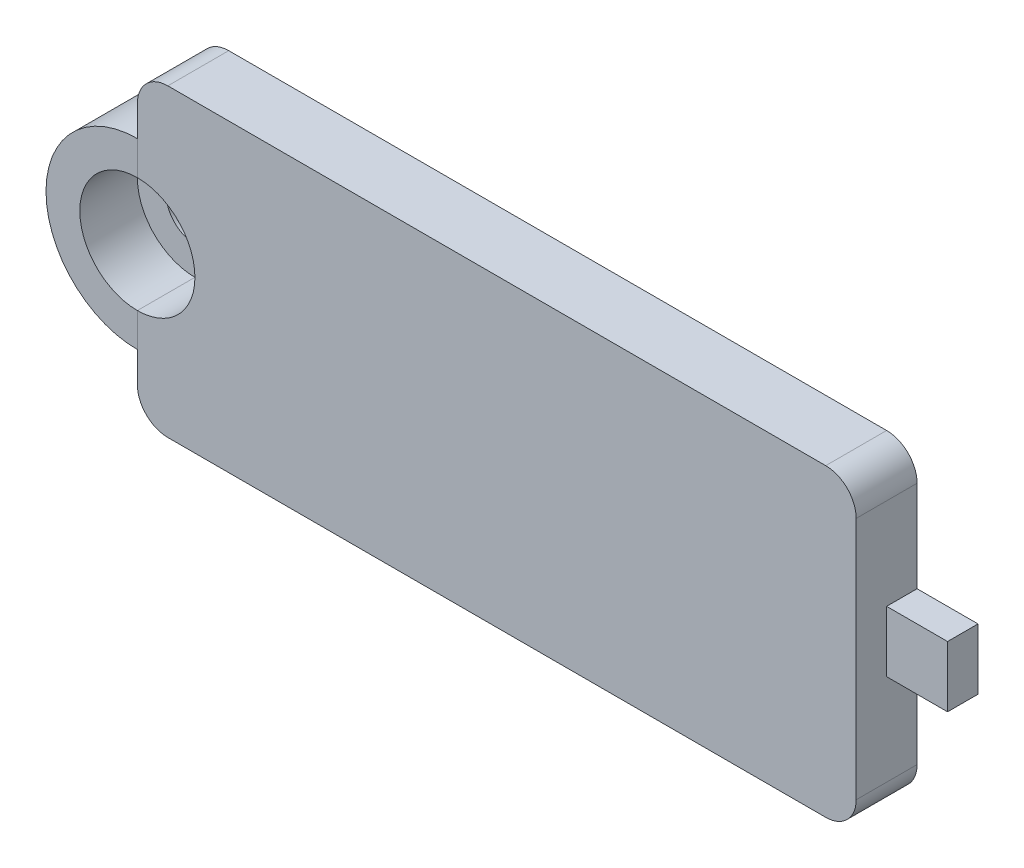
ISO-10303-21;
HEADER;
FILE_DESCRIPTION(('STEP AP214'),'2;1');
FILE_NAME('part.step','',(''),(''),'','','');
FILE_SCHEMA(('AUTOMOTIVE_DESIGN { 1 0 10303 214 1 1 1 1 }'));
ENDSEC;
DATA;
#1=APPLICATION_CONTEXT('core data for automotive mechanical design processes');
#2=APPLICATION_PROTOCOL_DEFINITION('international standard','automotive_design',2000,#1);
#3=PRODUCT_CONTEXT('',#1,'mechanical');
#4=PRODUCT('Part','Part','',(#3));
#5=PRODUCT_RELATED_PRODUCT_CATEGORY('part','',(#4));
#6=PRODUCT_DEFINITION_FORMATION('','',#4);
#7=PRODUCT_DEFINITION_CONTEXT('part definition',#1,'design');
#8=PRODUCT_DEFINITION('design','',#6,#7);
#9=PRODUCT_DEFINITION_SHAPE('','',#8);
#10=(LENGTH_UNIT() NAMED_UNIT(*) SI_UNIT(.MILLI.,.METRE.));
#11=(NAMED_UNIT(*) PLANE_ANGLE_UNIT() SI_UNIT($,.RADIAN.));
#12=(NAMED_UNIT(*) SI_UNIT($,.STERADIAN.) SOLID_ANGLE_UNIT());
#13=UNCERTAINTY_MEASURE_WITH_UNIT(LENGTH_MEASURE(1.E-05),#10,'distance_accuracy_value','');
#14=(GEOMETRIC_REPRESENTATION_CONTEXT(3) GLOBAL_UNCERTAINTY_ASSIGNED_CONTEXT((#13)) GLOBAL_UNIT_ASSIGNED_CONTEXT((#10,
#11,#12)) REPRESENTATION_CONTEXT('',''));
#15=CARTESIAN_POINT('',(0.,0.,0.));
#16=DIRECTION('',(0.,0.,1.));
#17=DIRECTION('',(1.,0.,0.));
#18=AXIS2_PLACEMENT_3D('',#15,#16,#17);
#19=CARTESIAN_POINT('',(-18.7325,4.7625,0.));
#20=DIRECTION('',(1.,0.,0.));
#21=DIRECTION('',(0.,0.,-1.));
#22=AXIS2_PLACEMENT_3D('',#19,#20,#21);
#23=PLANE('',#22);
#24=DIRECTION('',(0.,0.,1.));
#25=VECTOR('',#24,1.);
#26=CARTESIAN_POINT('',(-18.7325,1.50000004800001,3.175));
#27=LINE('',#26,#25);
#28=CARTESIAN_POINT('',(-18.7325,1.500000048,0.));
#29=VERTEX_POINT('',#28);
#30=CARTESIAN_POINT('',(-18.7325,1.50000004800001,0.174999904000001));
#31=VERTEX_POINT('',#30);
#32=EDGE_CURVE('E105',#29,#31,#27,.T.);
#33=ORIENTED_EDGE('',*,*,#32,.F.);
#34=DIRECTION('',(0.,1.,0.));
#35=VECTOR('',#34,1.);
#36=CARTESIAN_POINT('',(-18.7325,4.7625,0.));
#37=LINE('',#36,#35);
#38=CARTESIAN_POINT('',(-18.7325,4.7625,0.));
#39=VERTEX_POINT('',#38);
#40=EDGE_CURVE('E76',#29,#39,#37,.T.);
#41=ORIENTED_EDGE('',*,*,#40,.T.);
#42=DIRECTION('',(0.,0.,1.));
#43=VECTOR('',#42,1.);
#44=CARTESIAN_POINT('',(-18.7325,4.7625,0.));
#45=LINE('',#44,#43);
#46=CARTESIAN_POINT('',(-18.7325,4.7625,3.175));
#47=VERTEX_POINT('',#46);
#48=EDGE_CURVE('E99',#39,#47,#45,.T.);
#49=ORIENTED_EDGE('',*,*,#48,.T.);
#50=DIRECTION('',(0.,1.,0.));
#51=VECTOR('',#50,1.);
#52=CARTESIAN_POINT('',(-18.7325,4.7625,3.175));
#53=LINE('',#52,#51);
#54=CARTESIAN_POINT('',(-18.7325,2.99999996899999,3.175));
#55=VERTEX_POINT('',#54);
#56=EDGE_CURVE('E90',#55,#47,#53,.T.);
#57=ORIENTED_EDGE('',*,*,#56,.F.);
#58=DIRECTION('',(0.,0.,1.));
#59=VECTOR('',#58,1.);
#60=CARTESIAN_POINT('',(-18.7325,2.99999996899999,3.175));
#61=LINE('',#60,#59);
#62=CARTESIAN_POINT('',(-18.7325,2.99999996899999,0.174999904000001));
#63=VERTEX_POINT('',#62);
#64=EDGE_CURVE('E67',#63,#55,#61,.T.);
#65=ORIENTED_EDGE('',*,*,#64,.F.);
#66=DIRECTION('',(0.,1.,0.));
#67=VECTOR('',#66,1.);
#68=CARTESIAN_POINT('',(-18.7325,4.7625,0.174999904000001));
#69=LINE('',#68,#67);
#70=EDGE_CURVE('E12',#31,#63,#69,.T.);
#71=ORIENTED_EDGE('',*,*,#70,.F.);
#72=EDGE_LOOP('',(#33,#41,#49,#57,#65,#71));
#73=FACE_BOUND('',#72,.T.);
#74=ADVANCED_FACE('F52',(#73),#23,.T.);
#75=CARTESIAN_POINT('',(-18.7325,0.,0.));
#76=DIRECTION('',(0.,0.,1.));
#77=DIRECTION('',(1.,0.,0.));
#78=AXIS2_PLACEMENT_3D('',#75,#76,#77);
#79=CYLINDRICAL_SURFACE('',#78,4.7625);
#80=CARTESIAN_POINT('',(-18.7325,0.,3.175));
#81=DIRECTION('',(0.,0.,1.));
#82=DIRECTION('',(1.,0.,0.));
#83=AXIS2_PLACEMENT_3D('',#80,#81,#82);
#84=CIRCLE('',#83,4.7625);
#85=CARTESIAN_POINT('',(-18.7325,-4.7625,3.175));
#86=VERTEX_POINT('',#85);
#87=EDGE_CURVE('E94',#47,#86,#84,.T.);
#88=ORIENTED_EDGE('',*,*,#87,.F.);
#89=ORIENTED_EDGE('',*,*,#48,.F.);
#90=CARTESIAN_POINT('',(-18.7325,0.,0.));
#91=DIRECTION('',(0.,0.,1.));
#92=DIRECTION('',(1.,0.,0.));
#93=AXIS2_PLACEMENT_3D('',#90,#91,#92);
#94=CIRCLE('',#93,4.7625);
#95=CARTESIAN_POINT('',(-18.7325,-4.7625,0.));
#96=VERTEX_POINT('',#95);
#97=EDGE_CURVE('E113',#39,#96,#94,.T.);
#98=ORIENTED_EDGE('',*,*,#97,.T.);
#99=DIRECTION('',(0.,0.,1.));
#100=VECTOR('',#99,1.);
#101=CARTESIAN_POINT('',(-18.7325,-4.7625,0.));
#102=LINE('',#101,#100);
#103=EDGE_CURVE('E103',#96,#86,#102,.T.);
#104=ORIENTED_EDGE('',*,*,#103,.T.);
#105=EDGE_LOOP('',(#88,#89,#98,#104));
#106=FACE_BOUND('',#105,.T.);
#107=ADVANCED_FACE('F54',(#106),#79,.T.);
#108=DIRECTION('',(0.,0.,1.));
#109=VECTOR('',#108,1.);
#110=CARTESIAN_POINT('',(-18.7325,-1.50000004800001,3.175));
#111=LINE('',#110,#109);
#112=CARTESIAN_POINT('',(-18.7325,-1.50000004800001,0.174999904000001));
#113=VERTEX_POINT('',#112);
#114=CARTESIAN_POINT('',(-18.7325,-1.500000048,0.));
#115=VERTEX_POINT('',#114);
#116=EDGE_CURVE('E108',#113,#115,#111,.F.);
#117=ORIENTED_EDGE('',*,*,#116,.F.);
#118=CARTESIAN_POINT('',(-18.7325,-2.99999996899999,0.174999904000001));
#119=VERTEX_POINT('',#118);
#120=EDGE_CURVE('E56',#119,#113,#69,.T.);
#121=ORIENTED_EDGE('',*,*,#120,.F.);
#122=DIRECTION('',(0.,0.,1.));
#123=VECTOR('',#122,1.);
#124=CARTESIAN_POINT('',(-18.7325,-2.99999996899999,3.175));
#125=LINE('',#124,#123);
#126=CARTESIAN_POINT('',(-18.7325,-2.99999996899999,3.175));
#127=VERTEX_POINT('',#126);
#128=EDGE_CURVE('E123',#127,#119,#125,.F.);
#129=ORIENTED_EDGE('',*,*,#128,.F.);
#130=EDGE_CURVE('E97',#86,#127,#53,.T.);
#131=ORIENTED_EDGE('',*,*,#130,.F.);
#132=ORIENTED_EDGE('',*,*,#103,.F.);
#133=EDGE_CURVE('E111',#96,#115,#37,.T.);
#134=ORIENTED_EDGE('',*,*,#133,.T.);
#135=EDGE_LOOP('',(#117,#121,#129,#131,#132,#134));
#136=FACE_BOUND('',#135,.T.);
#137=ADVANCED_FACE('F142',(#136),#23,.T.);
#138=CARTESIAN_POINT('',(-18.7325,0.,0.));
#139=DIRECTION('',(0.,0.,1.));
#140=DIRECTION('',(1.,0.,0.));
#141=AXIS2_PLACEMENT_3D('',#138,#139,#140);
#142=PLANE('',#141);
#143=ORIENTED_EDGE('',*,*,#40,.F.);
#144=CARTESIAN_POINT('',(-18.7325,0.,0.));
#145=DIRECTION('',(0.,0.,1.));
#146=DIRECTION('',(1.,0.,0.));
#147=AXIS2_PLACEMENT_3D('',#144,#145,#146);
#148=CIRCLE('',#147,1.500000048);
#149=EDGE_CURVE('E126',#29,#115,#148,.T.);
#150=ORIENTED_EDGE('',*,*,#149,.T.);
#151=ORIENTED_EDGE('',*,*,#133,.F.);
#152=ORIENTED_EDGE('',*,*,#97,.F.);
#153=EDGE_LOOP('',(#143,#150,#151,#152));
#154=FACE_BOUND('',#153,.T.);
#155=ADVANCED_FACE('F157',(#154),#142,.F.);
#156=CARTESIAN_POINT('',(-18.7325,0.,3.175));
#157=DIRECTION('',(0.,0.,1.));
#158=DIRECTION('',(1.,0.,0.));
#159=AXIS2_PLACEMENT_3D('',#156,#157,#158);
#160=PLANE('',#159);
#161=CARTESIAN_POINT('',(-18.7325,0.,3.175));
#162=DIRECTION('',(0.,0.,1.));
#163=DIRECTION('',(1.,0.,0.));
#164=AXIS2_PLACEMENT_3D('',#161,#162,#163);
#165=CIRCLE('',#164,2.99999996899999);
#166=EDGE_CURVE('E96',#55,#127,#165,.T.);
#167=ORIENTED_EDGE('',*,*,#166,.F.);
#168=ORIENTED_EDGE('',*,*,#56,.T.);
#169=ORIENTED_EDGE('',*,*,#87,.T.);
#170=ORIENTED_EDGE('',*,*,#130,.T.);
#171=EDGE_LOOP('',(#167,#168,#169,#170));
#172=FACE_BOUND('',#171,.T.);
#173=ADVANCED_FACE('F91',(#172),#160,.T.);
#174=CARTESIAN_POINT('',(-18.7325,0.,3.175));
#175=DIRECTION('',(0.,0.,1.));
#176=DIRECTION('',(1.,0.,0.));
#177=AXIS2_PLACEMENT_3D('',#174,#175,#176);
#178=CYLINDRICAL_SURFACE('',#177,1.50000004800001);
#179=ORIENTED_EDGE('',*,*,#32,.T.);
#180=CARTESIAN_POINT('',(-18.7325,0.,0.174999904000001));
#181=DIRECTION('',(0.,0.,1.));
#182=DIRECTION('',(1.,0.,0.));
#183=AXIS2_PLACEMENT_3D('',#180,#181,#182);
#184=CIRCLE('',#183,1.50000004800001);
#185=EDGE_CURVE('E129',#31,#113,#184,.T.);
#186=ORIENTED_EDGE('',*,*,#185,.T.);
#187=ORIENTED_EDGE('',*,*,#116,.T.);
#188=ORIENTED_EDGE('',*,*,#149,.F.);
#189=EDGE_LOOP('',(#179,#186,#187,#188));
#190=FACE_BOUND('',#189,.T.);
#191=ADVANCED_FACE('F152',(#190),#178,.F.);
#192=CARTESIAN_POINT('',(-17.232499952,0.,0.174999904000001));
#193=DIRECTION('',(0.,0.,-1.));
#194=DIRECTION('',(-1.,0.,0.));
#195=AXIS2_PLACEMENT_3D('',#192,#193,#194);
#196=PLANE('',#195);
#197=ORIENTED_EDGE('',*,*,#120,.T.);
#198=ORIENTED_EDGE('',*,*,#185,.F.);
#199=ORIENTED_EDGE('',*,*,#70,.T.);
#200=CARTESIAN_POINT('',(-18.7325,0.,0.174999904000001));
#201=DIRECTION('',(0.,0.,1.));
#202=DIRECTION('',(1.,0.,0.));
#203=AXIS2_PLACEMENT_3D('',#200,#201,#202);
#204=CIRCLE('',#203,2.99999996899999);
#205=EDGE_CURVE('E132',#63,#119,#204,.T.);
#206=ORIENTED_EDGE('',*,*,#205,.T.);
#207=EDGE_LOOP('',(#197,#198,#199,#206));
#208=FACE_BOUND('',#207,.T.);
#209=ADVANCED_FACE('F148',(#208),#196,.F.);
#210=CARTESIAN_POINT('',(-18.7325,0.,3.175));
#211=DIRECTION('',(0.,0.,1.));
#212=DIRECTION('',(1.,0.,0.));
#213=AXIS2_PLACEMENT_3D('',#210,#211,#212);
#214=CYLINDRICAL_SURFACE('',#213,2.99999996899999);
#215=ORIENTED_EDGE('',*,*,#64,.T.);
#216=ORIENTED_EDGE('',*,*,#166,.T.);
#217=ORIENTED_EDGE('',*,*,#128,.T.);
#218=ORIENTED_EDGE('',*,*,#205,.F.);
#219=EDGE_LOOP('',(#215,#216,#217,#218));
#220=FACE_BOUND('',#219,.T.);
#221=ADVANCED_FACE('F137',(#220),#214,.F.);
#222=CLOSED_SHELL('',(#74,#107,#137,#155,#173,#191,#209,#221));
#223=MANIFOLD_SOLID_BREP('B2',#222);
#224=CARTESIAN_POINT('',(-18.7325,-7.9375,3.175));
#225=DIRECTION('',(1.,0.,0.));
#226=DIRECTION('',(0.,0.,-1.));
#227=AXIS2_PLACEMENT_3D('',#224,#225,#226);
#228=PLANE('',#227);
#229=DIRECTION('',(0.,-1.,0.));
#230=VECTOR('',#229,1.);
#231=CARTESIAN_POINT('',(-18.7325,-7.9375,3.175));
#232=LINE('',#231,#230);
#233=CARTESIAN_POINT('',(-18.7325,6.35,3.175));
#234=VERTEX_POINT('',#233);
#235=CARTESIAN_POINT('',(-18.7325,2.99999996899999,3.175));
#236=VERTEX_POINT('',#235);
#237=EDGE_CURVE('E444',#234,#236,#232,.T.);
#238=ORIENTED_EDGE('',*,*,#237,.F.);
#239=DIRECTION('',(0.,0.,-1.));
#240=VECTOR('',#239,1.);
#241=CARTESIAN_POINT('',(-18.7325,6.35,3.175));
#242=LINE('',#241,#240);
#243=CARTESIAN_POINT('',(-18.7325,6.35,0.));
#244=VERTEX_POINT('',#243);
#245=EDGE_CURVE('E50',#234,#244,#242,.T.);
#246=ORIENTED_EDGE('',*,*,#245,.T.);
#247=DIRECTION('',(0.,-1.,0.));
#248=VECTOR('',#247,1.);
#249=CARTESIAN_POINT('',(-18.7325,-7.9375,0.));
#250=LINE('',#249,#248);
#251=CARTESIAN_POINT('',(-18.7325,1.500000048,0.));
#252=VERTEX_POINT('',#251);
#253=EDGE_CURVE('E458',#244,#252,#250,.T.);
#254=ORIENTED_EDGE('',*,*,#253,.T.);
#255=DIRECTION('',(0.,0.,1.));
#256=VECTOR('',#255,1.);
#257=CARTESIAN_POINT('',(-18.7325,1.50000004800001,3.175));
#258=LINE('',#257,#256);
#259=CARTESIAN_POINT('',(-18.7325,1.50000004800001,0.174999904000001));
#260=VERTEX_POINT('',#259);
#261=EDGE_CURVE('E421',#252,#260,#258,.T.);
#262=ORIENTED_EDGE('',*,*,#261,.T.);
#263=DIRECTION('',(0.,1.,0.));
#264=VECTOR('',#263,1.);
#265=CARTESIAN_POINT('',(-18.7325,-7.9375,0.174999904000001));
#266=LINE('',#265,#264);
#267=CARTESIAN_POINT('',(-18.7325,2.99999996899999,0.174999904000001));
#268=VERTEX_POINT('',#267);
#269=EDGE_CURVE('E467',#260,#268,#266,.T.);
#270=ORIENTED_EDGE('',*,*,#269,.T.);
#271=DIRECTION('',(0.,0.,1.));
#272=VECTOR('',#271,1.);
#273=CARTESIAN_POINT('',(-18.7325,2.99999996899999,3.175));
#274=LINE('',#273,#272);
#275=EDGE_CURVE('E429',#268,#236,#274,.T.);
#276=ORIENTED_EDGE('',*,*,#275,.T.);
#277=EDGE_LOOP('',(#238,#246,#254,#262,#270,#276));
#278=FACE_BOUND('',#277,.T.);
#279=ADVANCED_FACE('F240',(#278),#228,.F.);
#280=CARTESIAN_POINT('',(0.,0.,0.));
#281=DIRECTION('',(0.,0.,-1.));
#282=DIRECTION('',(-1.,0.,0.));
#283=AXIS2_PLACEMENT_3D('',#280,#281,#282);
#284=PLANE('',#283);
#285=DIRECTION('',(1.,0.,0.));
#286=VECTOR('',#285,1.);
#287=CARTESIAN_POINT('',(-18.7325,-7.9375,0.));
#288=LINE('',#287,#286);
#289=CARTESIAN_POINT('',(-17.145,-7.9375,0.));
#290=VERTEX_POINT('',#289);
#291=CARTESIAN_POINT('',(17.145,-7.9375,0.));
#292=VERTEX_POINT('',#291);
#293=EDGE_CURVE('E439',#290,#292,#288,.T.);
#294=ORIENTED_EDGE('',*,*,#293,.F.);
#295=CARTESIAN_POINT('',(-17.145,-6.35,0.));
#296=DIRECTION('',(0.,0.,-1.));
#297=DIRECTION('',(-1.,0.,0.));
#298=AXIS2_PLACEMENT_3D('',#295,#296,#297);
#299=CIRCLE('',#298,1.5875);
#300=CARTESIAN_POINT('',(-18.7325,-6.35,0.));
#301=VERTEX_POINT('',#300);
#302=EDGE_CURVE('E485',#290,#301,#299,.T.);
#303=ORIENTED_EDGE('',*,*,#302,.T.);
#304=CARTESIAN_POINT('',(-18.7325,-1.500000048,0.));
#305=VERTEX_POINT('',#304);
#306=EDGE_CURVE('E457',#305,#301,#250,.T.);
#307=ORIENTED_EDGE('',*,*,#306,.F.);
#308=CARTESIAN_POINT('',(-18.7325,0.,0.));
#309=DIRECTION('',(0.,0.,1.));
#310=DIRECTION('',(1.,0.,0.));
#311=AXIS2_PLACEMENT_3D('',#308,#309,#310);
#312=CIRCLE('',#311,1.500000048);
#313=EDGE_CURVE('E404',#305,#252,#312,.T.);
#314=ORIENTED_EDGE('',*,*,#313,.T.);
#315=ORIENTED_EDGE('',*,*,#253,.F.);
#316=CARTESIAN_POINT('',(-17.145,6.35,0.));
#317=DIRECTION('',(0.,0.,-1.));
#318=DIRECTION('',(-1.,0.,0.));
#319=AXIS2_PLACEMENT_3D('',#316,#317,#318);
#320=CIRCLE('',#319,1.5875);
#321=CARTESIAN_POINT('',(-17.145,7.9375,0.));
#322=VERTEX_POINT('',#321);
#323=EDGE_CURVE('E475',#244,#322,#320,.T.);
#324=ORIENTED_EDGE('',*,*,#323,.T.);
#325=DIRECTION('',(-1.,0.,0.));
#326=VECTOR('',#325,1.);
#327=CARTESIAN_POINT('',(-18.7325,7.9375,0.));
#328=LINE('',#327,#326);
#329=CARTESIAN_POINT('',(17.145,7.9375,0.));
#330=VERTEX_POINT('',#329);
#331=EDGE_CURVE('E453',#330,#322,#328,.T.);
#332=ORIENTED_EDGE('',*,*,#331,.F.);
#333=CARTESIAN_POINT('',(17.145,6.35,0.));
#334=DIRECTION('',(0.,0.,-1.));
#335=DIRECTION('',(-1.,0.,0.));
#336=AXIS2_PLACEMENT_3D('',#333,#334,#335);
#337=CIRCLE('',#336,1.5875);
#338=CARTESIAN_POINT('',(18.7325,6.35,0.));
#339=VERTEX_POINT('',#338);
#340=EDGE_CURVE('E478',#330,#339,#337,.T.);
#341=ORIENTED_EDGE('',*,*,#340,.T.);
#342=DIRECTION('',(0.,1.,0.));
#343=VECTOR('',#342,1.);
#344=CARTESIAN_POINT('',(18.7325,-7.9375,0.));
#345=LINE('',#344,#343);
#346=CARTESIAN_POINT('',(18.7325,1.5875,0.));
#347=VERTEX_POINT('',#346);
#348=EDGE_CURVE('E433',#347,#339,#345,.T.);
#349=ORIENTED_EDGE('',*,*,#348,.F.);
#350=DIRECTION('',(1.,0.,0.));
#351=VECTOR('',#350,1.);
#352=CARTESIAN_POINT('',(18.7325,1.5875,0.));
#353=LINE('',#352,#351);
#354=CARTESIAN_POINT('',(21.9075,1.5875,0.));
#355=VERTEX_POINT('',#354);
#356=EDGE_CURVE('E385',#347,#355,#353,.T.);
#357=ORIENTED_EDGE('',*,*,#356,.T.);
#358=DIRECTION('',(0.,-1.,0.));
#359=VECTOR('',#358,1.);
#360=CARTESIAN_POINT('',(21.9075,1.5875,0.));
#361=LINE('',#360,#359);
#362=CARTESIAN_POINT('',(21.9075,-1.5875,0.));
#363=VERTEX_POINT('',#362);
#364=EDGE_CURVE('E359',#355,#363,#361,.T.);
#365=ORIENTED_EDGE('',*,*,#364,.T.);
#366=DIRECTION('',(-1.,0.,0.));
#367=VECTOR('',#366,1.);
#368=CARTESIAN_POINT('',(18.7325,-1.5875,0.));
#369=LINE('',#368,#367);
#370=CARTESIAN_POINT('',(18.7325,-1.5875,0.));
#371=VERTEX_POINT('',#370);
#372=EDGE_CURVE('E380',#363,#371,#369,.T.);
#373=ORIENTED_EDGE('',*,*,#372,.T.);
#374=CARTESIAN_POINT('',(18.7325,-6.35,0.));
#375=VERTEX_POINT('',#374);
#376=EDGE_CURVE('E450',#375,#371,#345,.T.);
#377=ORIENTED_EDGE('',*,*,#376,.F.);
#378=CARTESIAN_POINT('',(17.145,-6.35,0.));
#379=DIRECTION('',(0.,0.,-1.));
#380=DIRECTION('',(-1.,0.,0.));
#381=AXIS2_PLACEMENT_3D('',#378,#379,#380);
#382=CIRCLE('',#381,1.5875);
#383=EDGE_CURVE('E482',#375,#292,#382,.T.);
#384=ORIENTED_EDGE('',*,*,#383,.T.);
#385=EDGE_LOOP('',(#294,#303,#307,#314,#315,#324,#332,#341,#349,#357,#365,#373,#377,#384));
#386=FACE_BOUND('',#385,.T.);
#387=ADVANCED_FACE('F524',(#386),#284,.T.);
#388=CARTESIAN_POINT('',(0.,0.,3.175));
#389=DIRECTION('',(0.,0.,-1.));
#390=DIRECTION('',(-1.,0.,0.));
#391=AXIS2_PLACEMENT_3D('',#388,#389,#390);
#392=PLANE('',#391);
#393=CARTESIAN_POINT('',(-18.7325,-2.99999996899999,3.175));
#394=VERTEX_POINT('',#393);
#395=CARTESIAN_POINT('',(-18.7325,-6.35,3.175));
#396=VERTEX_POINT('',#395);
#397=EDGE_CURVE('E443',#394,#396,#232,.T.);
#398=ORIENTED_EDGE('',*,*,#397,.T.);
#399=CARTESIAN_POINT('',(-17.145,-6.35,3.175));
#400=DIRECTION('',(0.,0.,-1.));
#401=DIRECTION('',(-1.,0.,0.));
#402=AXIS2_PLACEMENT_3D('',#399,#400,#401);
#403=CIRCLE('',#402,1.5875);
#404=CARTESIAN_POINT('',(-17.145,-7.9375,3.175));
#405=VERTEX_POINT('',#404);
#406=EDGE_CURVE('E500',#396,#405,#403,.F.);
#407=ORIENTED_EDGE('',*,*,#406,.T.);
#408=DIRECTION('',(1.,0.,0.));
#409=VECTOR('',#408,1.);
#410=CARTESIAN_POINT('',(-18.7325,-7.9375,3.175));
#411=LINE('',#410,#409);
#412=CARTESIAN_POINT('',(17.145,-7.9375,3.175));
#413=VERTEX_POINT('',#412);
#414=EDGE_CURVE('E405',#405,#413,#411,.T.);
#415=ORIENTED_EDGE('',*,*,#414,.T.);
#416=CARTESIAN_POINT('',(17.145,-6.35,3.175));
#417=DIRECTION('',(0.,0.,-1.));
#418=DIRECTION('',(-1.,0.,0.));
#419=AXIS2_PLACEMENT_3D('',#416,#417,#418);
#420=CIRCLE('',#419,1.5875);
#421=CARTESIAN_POINT('',(18.7325,-6.35,3.175));
#422=VERTEX_POINT('',#421);
#423=EDGE_CURVE('E497',#413,#422,#420,.F.);
#424=ORIENTED_EDGE('',*,*,#423,.T.);
#425=DIRECTION('',(0.,1.,0.));
#426=VECTOR('',#425,1.);
#427=CARTESIAN_POINT('',(18.7325,-7.9375,3.175));
#428=LINE('',#427,#426);
#429=CARTESIAN_POINT('',(18.7325,6.35,3.175));
#430=VERTEX_POINT('',#429);
#431=EDGE_CURVE('E434',#422,#430,#428,.T.);
#432=ORIENTED_EDGE('',*,*,#431,.T.);
#433=CARTESIAN_POINT('',(17.145,6.35,3.175));
#434=DIRECTION('',(0.,0.,-1.));
#435=DIRECTION('',(-1.,0.,0.));
#436=AXIS2_PLACEMENT_3D('',#433,#434,#435);
#437=CIRCLE('',#436,1.5875);
#438=CARTESIAN_POINT('',(17.145,7.9375,3.175));
#439=VERTEX_POINT('',#438);
#440=EDGE_CURVE('E494',#430,#439,#437,.F.);
#441=ORIENTED_EDGE('',*,*,#440,.T.);
#442=DIRECTION('',(-1.,0.,0.));
#443=VECTOR('',#442,1.);
#444=CARTESIAN_POINT('',(-18.7325,7.9375,3.175));
#445=LINE('',#444,#443);
#446=CARTESIAN_POINT('',(-17.145,7.9375,3.175));
#447=VERTEX_POINT('',#446);
#448=EDGE_CURVE('E438',#439,#447,#445,.T.);
#449=ORIENTED_EDGE('',*,*,#448,.T.);
#450=CARTESIAN_POINT('',(-17.145,6.35,3.175));
#451=DIRECTION('',(0.,0.,-1.));
#452=DIRECTION('',(-1.,0.,0.));
#453=AXIS2_PLACEMENT_3D('',#450,#451,#452);
#454=CIRCLE('',#453,1.5875);
#455=EDGE_CURVE('E491',#447,#234,#454,.F.);
#456=ORIENTED_EDGE('',*,*,#455,.T.);
#457=ORIENTED_EDGE('',*,*,#237,.T.);
#458=CARTESIAN_POINT('',(-18.7325,0.,3.175));
#459=DIRECTION('',(0.,0.,1.));
#460=DIRECTION('',(1.,0.,0.));
#461=AXIS2_PLACEMENT_3D('',#458,#459,#460);
#462=CIRCLE('',#461,2.99999996899999);
#463=EDGE_CURVE('E400',#394,#236,#462,.T.);
#464=ORIENTED_EDGE('',*,*,#463,.F.);
#465=EDGE_LOOP('',(#398,#407,#415,#424,#432,#441,#449,#456,#457,#464));
#466=FACE_BOUND('',#465,.T.);
#467=ADVANCED_FACE('F537',(#466),#392,.F.);
#468=CARTESIAN_POINT('',(18.7325,-7.9375,3.175));
#469=DIRECTION('',(-1.,0.,0.));
#470=DIRECTION('',(0.,0.,1.));
#471=AXIS2_PLACEMENT_3D('',#468,#469,#470);
#472=PLANE('',#471);
#473=ORIENTED_EDGE('',*,*,#376,.T.);
#474=DIRECTION('',(0.,0.,-1.));
#475=VECTOR('',#474,1.);
#476=CARTESIAN_POINT('',(18.7325,-1.5875,1.5875));
#477=LINE('',#476,#475);
#478=CARTESIAN_POINT('',(18.7325,-1.5875,1.5875));
#479=VERTEX_POINT('',#478);
#480=EDGE_CURVE('E261',#479,#371,#477,.T.);
#481=ORIENTED_EDGE('',*,*,#480,.F.);
#482=DIRECTION('',(0.,1.,0.));
#483=VECTOR('',#482,1.);
#484=CARTESIAN_POINT('',(18.7325,1.5875,1.5875));
#485=LINE('',#484,#483);
#486=CARTESIAN_POINT('',(18.7325,1.5875,1.5875));
#487=VERTEX_POINT('',#486);
#488=EDGE_CURVE('E256',#479,#487,#485,.T.);
#489=ORIENTED_EDGE('',*,*,#488,.T.);
#490=DIRECTION('',(0.,0.,-1.));
#491=VECTOR('',#490,1.);
#492=CARTESIAN_POINT('',(18.7325,1.5875,1.5875));
#493=LINE('',#492,#491);
#494=EDGE_CURVE('E366',#487,#347,#493,.T.);
#495=ORIENTED_EDGE('',*,*,#494,.T.);
#496=ORIENTED_EDGE('',*,*,#348,.T.);
#497=DIRECTION('',(0.,0.,-1.));
#498=VECTOR('',#497,1.);
#499=CARTESIAN_POINT('',(18.7325,6.35,3.175));
#500=LINE('',#499,#498);
#501=EDGE_CURVE('E503',#339,#430,#500,.F.);
#502=ORIENTED_EDGE('',*,*,#501,.T.);
#503=ORIENTED_EDGE('',*,*,#431,.F.);
#504=DIRECTION('',(0.,0.,-1.));
#505=VECTOR('',#504,1.);
#506=CARTESIAN_POINT('',(18.7325,-6.35,3.175));
#507=LINE('',#506,#505);
#508=EDGE_CURVE('E506',#422,#375,#507,.T.);
#509=ORIENTED_EDGE('',*,*,#508,.T.);
#510=EDGE_LOOP('',(#473,#481,#489,#495,#496,#502,#503,#509));
#511=FACE_BOUND('',#510,.T.);
#512=ADVANCED_FACE('F550',(#511),#472,.F.);
#513=CARTESIAN_POINT('',(-18.7325,7.9375,3.175));
#514=DIRECTION('',(0.,-1.,0.));
#515=DIRECTION('',(0.,0.,-1.));
#516=AXIS2_PLACEMENT_3D('',#513,#514,#515);
#517=PLANE('',#516);
#518=ORIENTED_EDGE('',*,*,#448,.F.);
#519=DIRECTION('',(0.,0.,-1.));
#520=VECTOR('',#519,1.);
#521=CARTESIAN_POINT('',(17.145,7.9375,3.175));
#522=LINE('',#521,#520);
#523=EDGE_CURVE('E249',#439,#330,#522,.T.);
#524=ORIENTED_EDGE('',*,*,#523,.T.);
#525=ORIENTED_EDGE('',*,*,#331,.T.);
#526=DIRECTION('',(0.,0.,-1.));
#527=VECTOR('',#526,1.);
#528=CARTESIAN_POINT('',(-17.145,7.9375,3.175));
#529=LINE('',#528,#527);
#530=EDGE_CURVE('E510',#322,#447,#529,.F.);
#531=ORIENTED_EDGE('',*,*,#530,.T.);
#532=EDGE_LOOP('',(#518,#524,#525,#531));
#533=FACE_BOUND('',#532,.T.);
#534=ADVANCED_FACE('F518',(#533),#517,.F.);
#535=ORIENTED_EDGE('',*,*,#306,.T.);
#536=DIRECTION('',(0.,0.,-1.));
#537=VECTOR('',#536,1.);
#538=CARTESIAN_POINT('',(-18.7325,-6.35,3.175));
#539=LINE('',#538,#537);
#540=EDGE_CURVE('E488',#301,#396,#539,.F.);
#541=ORIENTED_EDGE('',*,*,#540,.T.);
#542=ORIENTED_EDGE('',*,*,#397,.F.);
#543=DIRECTION('',(0.,0.,1.));
#544=VECTOR('',#543,1.);
#545=CARTESIAN_POINT('',(-18.7325,-2.99999996899999,3.175));
#546=LINE('',#545,#544);
#547=CARTESIAN_POINT('',(-18.7325,-2.99999996899999,0.174999904000001));
#548=VERTEX_POINT('',#547);
#549=EDGE_CURVE('E425',#394,#548,#546,.F.);
#550=ORIENTED_EDGE('',*,*,#549,.T.);
#551=CARTESIAN_POINT('',(-18.7325,-1.50000004800001,0.174999904000001));
#552=VERTEX_POINT('',#551);
#553=EDGE_CURVE('E417',#548,#552,#266,.T.);
#554=ORIENTED_EDGE('',*,*,#553,.T.);
#555=DIRECTION('',(0.,0.,1.));
#556=VECTOR('',#555,1.);
#557=CARTESIAN_POINT('',(-18.7325,-1.50000004800001,3.175));
#558=LINE('',#557,#556);
#559=EDGE_CURVE('E413',#552,#305,#558,.F.);
#560=ORIENTED_EDGE('',*,*,#559,.T.);
#561=EDGE_LOOP('',(#535,#541,#542,#550,#554,#560));
#562=FACE_BOUND('',#561,.T.);
#563=ADVANCED_FACE('F544',(#562),#228,.F.);
#564=CARTESIAN_POINT('',(-18.7325,-7.9375,3.175));
#565=DIRECTION('',(0.,1.,0.));
#566=DIRECTION('',(0.,0.,1.));
#567=AXIS2_PLACEMENT_3D('',#564,#565,#566);
#568=PLANE('',#567);
#569=ORIENTED_EDGE('',*,*,#414,.F.);
#570=DIRECTION('',(0.,0.,-1.));
#571=VECTOR('',#570,1.);
#572=CARTESIAN_POINT('',(-17.145,-7.9375,3.175));
#573=LINE('',#572,#571);
#574=EDGE_CURVE('E471',#405,#290,#573,.T.);
#575=ORIENTED_EDGE('',*,*,#574,.T.);
#576=ORIENTED_EDGE('',*,*,#293,.T.);
#577=DIRECTION('',(0.,0.,-1.));
#578=VECTOR('',#577,1.);
#579=CARTESIAN_POINT('',(17.145,-7.9375,3.175));
#580=LINE('',#579,#578);
#581=EDGE_CURVE('E468',#292,#413,#580,.F.);
#582=ORIENTED_EDGE('',*,*,#581,.T.);
#583=EDGE_LOOP('',(#569,#575,#576,#582));
#584=FACE_BOUND('',#583,.T.);
#585=ADVANCED_FACE('F575',(#584),#568,.F.);
#586=CARTESIAN_POINT('',(-17.232499952,0.,0.174999904000001));
#587=DIRECTION('',(0.,0.,-1.));
#588=DIRECTION('',(-1.,0.,0.));
#589=AXIS2_PLACEMENT_3D('',#586,#587,#588);
#590=PLANE('',#589);
#591=CARTESIAN_POINT('',(-18.7325,0.,0.174999904000001));
#592=DIRECTION('',(0.,0.,1.));
#593=DIRECTION('',(1.,0.,0.));
#594=AXIS2_PLACEMENT_3D('',#591,#592,#593);
#595=CIRCLE('',#594,2.99999996899999);
#596=EDGE_CURVE('E395',#548,#268,#595,.T.);
#597=ORIENTED_EDGE('',*,*,#596,.T.);
#598=ORIENTED_EDGE('',*,*,#269,.F.);
#599=CARTESIAN_POINT('',(-18.7325,0.,0.174999904000001));
#600=DIRECTION('',(0.,0.,1.));
#601=DIRECTION('',(1.,0.,0.));
#602=AXIS2_PLACEMENT_3D('',#599,#600,#601);
#603=CIRCLE('',#602,1.50000004800001);
#604=EDGE_CURVE('E409',#552,#260,#603,.T.);
#605=ORIENTED_EDGE('',*,*,#604,.F.);
#606=ORIENTED_EDGE('',*,*,#553,.F.);
#607=EDGE_LOOP('',(#597,#598,#605,#606));
#608=FACE_BOUND('',#607,.T.);
#609=ADVANCED_FACE('F580',(#608),#590,.F.);
#610=CARTESIAN_POINT('',(-18.7325,0.,3.175));
#611=DIRECTION('',(0.,0.,1.));
#612=DIRECTION('',(1.,0.,0.));
#613=AXIS2_PLACEMENT_3D('',#610,#611,#612);
#614=CYLINDRICAL_SURFACE('',#613,2.99999996899999);
#615=ORIENTED_EDGE('',*,*,#596,.F.);
#616=ORIENTED_EDGE('',*,*,#549,.F.);
#617=ORIENTED_EDGE('',*,*,#463,.T.);
#618=ORIENTED_EDGE('',*,*,#275,.F.);
#619=EDGE_LOOP('',(#615,#616,#617,#618));
#620=FACE_BOUND('',#619,.T.);
#621=ADVANCED_FACE('F541',(#620),#614,.F.);
#622=CARTESIAN_POINT('',(-18.7325,0.,3.175));
#623=DIRECTION('',(0.,0.,1.));
#624=DIRECTION('',(1.,0.,0.));
#625=AXIS2_PLACEMENT_3D('',#622,#623,#624);
#626=CYLINDRICAL_SURFACE('',#625,1.50000004800001);
#627=ORIENTED_EDGE('',*,*,#313,.F.);
#628=ORIENTED_EDGE('',*,*,#559,.F.);
#629=ORIENTED_EDGE('',*,*,#604,.T.);
#630=ORIENTED_EDGE('',*,*,#261,.F.);
#631=EDGE_LOOP('',(#627,#628,#629,#630));
#632=FACE_BOUND('',#631,.T.);
#633=ADVANCED_FACE('F592',(#632),#626,.F.);
#634=CARTESIAN_POINT('',(-17.145,-6.35,3.175));
#635=DIRECTION('',(0.,0.,-1.));
#636=DIRECTION('',(-1.,0.,0.));
#637=AXIS2_PLACEMENT_3D('',#634,#635,#636);
#638=CYLINDRICAL_SURFACE('',#637,1.5875);
#639=ORIENTED_EDGE('',*,*,#406,.F.);
#640=ORIENTED_EDGE('',*,*,#540,.F.);
#641=ORIENTED_EDGE('',*,*,#302,.F.);
#642=ORIENTED_EDGE('',*,*,#574,.F.);
#643=EDGE_LOOP('',(#639,#640,#641,#642));
#644=FACE_BOUND('',#643,.T.);
#645=ADVANCED_FACE('F588',(#644),#638,.T.);
#646=CARTESIAN_POINT('',(17.145,-6.35,3.175));
#647=DIRECTION('',(0.,0.,-1.));
#648=DIRECTION('',(-1.,0.,0.));
#649=AXIS2_PLACEMENT_3D('',#646,#647,#648);
#650=CYLINDRICAL_SURFACE('',#649,1.5875);
#651=ORIENTED_EDGE('',*,*,#423,.F.);
#652=ORIENTED_EDGE('',*,*,#581,.F.);
#653=ORIENTED_EDGE('',*,*,#383,.F.);
#654=ORIENTED_EDGE('',*,*,#508,.F.);
#655=EDGE_LOOP('',(#651,#652,#653,#654));
#656=FACE_BOUND('',#655,.T.);
#657=ADVANCED_FACE('F591',(#656),#650,.T.);
#658=CARTESIAN_POINT('',(17.145,6.35,3.175));
#659=DIRECTION('',(0.,0.,-1.));
#660=DIRECTION('',(-1.,0.,0.));
#661=AXIS2_PLACEMENT_3D('',#658,#659,#660);
#662=CYLINDRICAL_SURFACE('',#661,1.5875);
#663=ORIENTED_EDGE('',*,*,#440,.F.);
#664=ORIENTED_EDGE('',*,*,#501,.F.);
#665=ORIENTED_EDGE('',*,*,#340,.F.);
#666=ORIENTED_EDGE('',*,*,#523,.F.);
#667=EDGE_LOOP('',(#663,#664,#665,#666));
#668=FACE_BOUND('',#667,.T.);
#669=ADVANCED_FACE('F564',(#668),#662,.T.);
#670=CARTESIAN_POINT('',(-17.145,6.35,3.175));
#671=DIRECTION('',(0.,0.,-1.));
#672=DIRECTION('',(-1.,0.,0.));
#673=AXIS2_PLACEMENT_3D('',#670,#671,#672);
#674=CYLINDRICAL_SURFACE('',#673,1.5875);
#675=ORIENTED_EDGE('',*,*,#455,.F.);
#676=ORIENTED_EDGE('',*,*,#530,.F.);
#677=ORIENTED_EDGE('',*,*,#323,.F.);
#678=ORIENTED_EDGE('',*,*,#245,.F.);
#679=EDGE_LOOP('',(#675,#676,#677,#678));
#680=FACE_BOUND('',#679,.T.);
#681=ADVANCED_FACE('F242',(#680),#674,.T.);
#682=CARTESIAN_POINT('',(18.7325,-1.5875,1.5875));
#683=DIRECTION('',(0.,-1.,0.));
#684=DIRECTION('',(0.,0.,-1.));
#685=AXIS2_PLACEMENT_3D('',#682,#683,#684);
#686=PLANE('',#685);
#687=ORIENTED_EDGE('',*,*,#372,.F.);
#688=DIRECTION('',(0.,0.,-1.));
#689=VECTOR('',#688,1.);
#690=CARTESIAN_POINT('',(21.9075,-1.5875,1.5875));
#691=LINE('',#690,#689);
#692=CARTESIAN_POINT('',(21.9075,-1.5875,1.5875));
#693=VERTEX_POINT('',#692);
#694=EDGE_CURVE('E365',#693,#363,#691,.T.);
#695=ORIENTED_EDGE('',*,*,#694,.F.);
#696=DIRECTION('',(-1.,0.,0.));
#697=VECTOR('',#696,1.);
#698=CARTESIAN_POINT('',(18.7325,-1.5875,1.5875));
#699=LINE('',#698,#697);
#700=EDGE_CURVE('E373',#693,#479,#699,.T.);
#701=ORIENTED_EDGE('',*,*,#700,.T.);
#702=ORIENTED_EDGE('',*,*,#480,.T.);
#703=EDGE_LOOP('',(#687,#695,#701,#702));
#704=FACE_BOUND('',#703,.T.);
#705=ADVANCED_FACE('F555',(#704),#686,.T.);
#706=CARTESIAN_POINT('',(21.9075,1.5875,1.5875));
#707=DIRECTION('',(1.,0.,0.));
#708=DIRECTION('',(0.,1.,0.));
#709=AXIS2_PLACEMENT_3D('',#706,#707,#708);
#710=PLANE('',#709);
#711=ORIENTED_EDGE('',*,*,#364,.F.);
#712=DIRECTION('',(0.,0.,-1.));
#713=VECTOR('',#712,1.);
#714=CARTESIAN_POINT('',(21.9075,1.5875,1.5875));
#715=LINE('',#714,#713);
#716=CARTESIAN_POINT('',(21.9075,1.5875,1.5875));
#717=VERTEX_POINT('',#716);
#718=EDGE_CURVE('E353',#717,#355,#715,.T.);
#719=ORIENTED_EDGE('',*,*,#718,.F.);
#720=DIRECTION('',(0.,-1.,0.));
#721=VECTOR('',#720,1.);
#722=CARTESIAN_POINT('',(21.9075,1.5875,1.5875));
#723=LINE('',#722,#721);
#724=EDGE_CURVE('E356',#717,#693,#723,.T.);
#725=ORIENTED_EDGE('',*,*,#724,.T.);
#726=ORIENTED_EDGE('',*,*,#694,.T.);
#727=EDGE_LOOP('',(#711,#719,#725,#726));
#728=FACE_BOUND('',#727,.T.);
#729=ADVANCED_FACE('F355',(#728),#710,.T.);
#730=CARTESIAN_POINT('',(18.7325,1.5875,1.5875));
#731=DIRECTION('',(0.,1.,0.));
#732=DIRECTION('',(-1.,0.,0.));
#733=AXIS2_PLACEMENT_3D('',#730,#731,#732);
#734=PLANE('',#733);
#735=ORIENTED_EDGE('',*,*,#356,.F.);
#736=ORIENTED_EDGE('',*,*,#494,.F.);
#737=DIRECTION('',(1.,0.,0.));
#738=VECTOR('',#737,1.);
#739=CARTESIAN_POINT('',(18.7325,1.5875,1.5875));
#740=LINE('',#739,#738);
#741=EDGE_CURVE('E371',#487,#717,#740,.T.);
#742=ORIENTED_EDGE('',*,*,#741,.T.);
#743=ORIENTED_EDGE('',*,*,#718,.T.);
#744=EDGE_LOOP('',(#735,#736,#742,#743));
#745=FACE_BOUND('',#744,.T.);
#746=ADVANCED_FACE('F376',(#745),#734,.T.);
#747=CARTESIAN_POINT('',(0.,0.,1.5875));
#748=DIRECTION('',(0.,0.,1.));
#749=DIRECTION('',(1.,0.,0.));
#750=AXIS2_PLACEMENT_3D('',#747,#748,#749);
#751=PLANE('',#750);
#752=ORIENTED_EDGE('',*,*,#488,.F.);
#753=ORIENTED_EDGE('',*,*,#700,.F.);
#754=ORIENTED_EDGE('',*,*,#724,.F.);
#755=ORIENTED_EDGE('',*,*,#741,.F.);
#756=EDGE_LOOP('',(#752,#753,#754,#755));
#757=FACE_BOUND('',#756,.T.);
#758=ADVANCED_FACE('F370',(#757),#751,.T.);
#759=CLOSED_SHELL('',(#279,#387,#467,#512,#534,#563,#585,#609,#621,#633,#645,#657,#669,#681,
#705,#729,#746,#758));
#760=MANIFOLD_SOLID_BREP('B6',#759);
#761=ADVANCED_BREP_SHAPE_REPRESENTATION('',(#18,#223,#760),#14);
#762=SHAPE_DEFINITION_REPRESENTATION(#9,#761);
ENDSEC;
END-ISO-10303-21;
